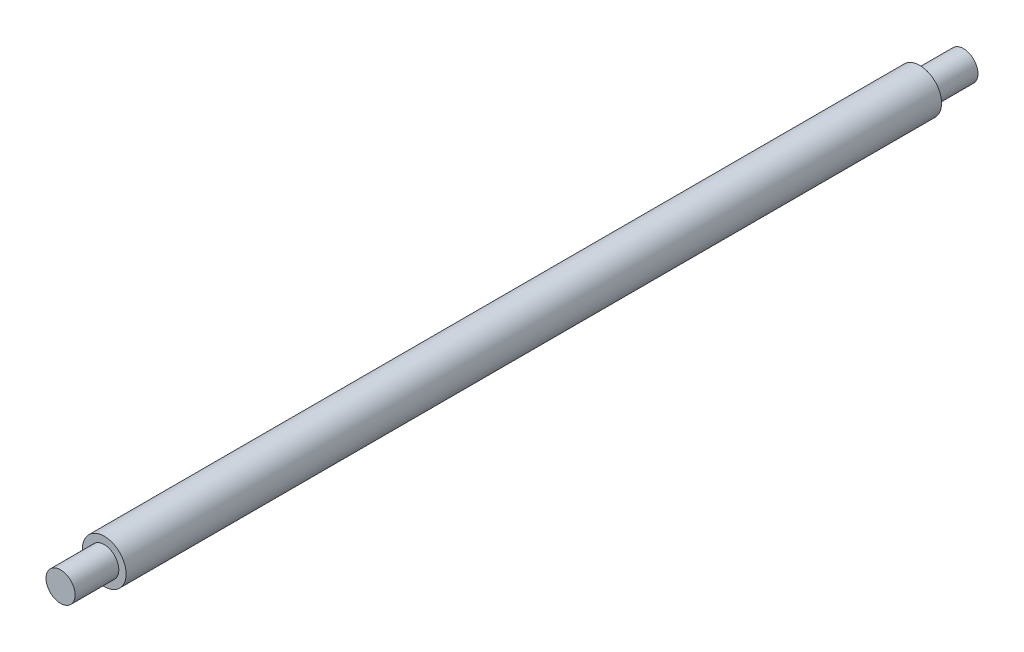
ISO-10303-21;
HEADER;
FILE_DESCRIPTION(('STEP AP214'),'2;1');
FILE_NAME('part.step','',(''),(''),'','','');
FILE_SCHEMA(('AUTOMOTIVE_DESIGN { 1 0 10303 214 1 1 1 1 }'));
ENDSEC;
DATA;
#1=APPLICATION_CONTEXT('core data for automotive mechanical design processes');
#2=APPLICATION_PROTOCOL_DEFINITION('international standard','automotive_design',2000,#1);
#3=PRODUCT_CONTEXT('',#1,'mechanical');
#4=PRODUCT('Part','Part','',(#3));
#5=PRODUCT_RELATED_PRODUCT_CATEGORY('part','',(#4));
#6=PRODUCT_DEFINITION_FORMATION('','',#4);
#7=PRODUCT_DEFINITION_CONTEXT('part definition',#1,'design');
#8=PRODUCT_DEFINITION('design','',#6,#7);
#9=PRODUCT_DEFINITION_SHAPE('','',#8);
#10=(LENGTH_UNIT() NAMED_UNIT(*) SI_UNIT(.MILLI.,.METRE.));
#11=(NAMED_UNIT(*) PLANE_ANGLE_UNIT() SI_UNIT($,.RADIAN.));
#12=(NAMED_UNIT(*) SI_UNIT($,.STERADIAN.) SOLID_ANGLE_UNIT());
#13=UNCERTAINTY_MEASURE_WITH_UNIT(LENGTH_MEASURE(1.E-05),#10,'distance_accuracy_value','');
#14=(GEOMETRIC_REPRESENTATION_CONTEXT(3) GLOBAL_UNCERTAINTY_ASSIGNED_CONTEXT((#13)) GLOBAL_UNIT_ASSIGNED_CONTEXT((#10,
#11,#12)) REPRESENTATION_CONTEXT('',''));
#15=CARTESIAN_POINT('',(0.,0.,0.));
#16=DIRECTION('',(0.,0.,1.));
#17=DIRECTION('',(1.,0.,0.));
#18=AXIS2_PLACEMENT_3D('',#15,#16,#17);
#19=CARTESIAN_POINT('',(0.,0.,355.6));
#20=DIRECTION('',(0.,0.,-1.));
#21=DIRECTION('',(-1.,0.,0.));
#22=AXIS2_PLACEMENT_3D('',#19,#20,#21);
#23=CYLINDRICAL_SURFACE('',#22,9.525);
#24=CARTESIAN_POINT('',(0.,0.,355.6));
#25=DIRECTION('',(0.,0.,1.));
#26=DIRECTION('',(1.,0.,0.));
#27=AXIS2_PLACEMENT_3D('',#24,#25,#26);
#28=CIRCLE('',#27,9.525);
#29=CARTESIAN_POINT('',(9.525,0.,355.6));
#30=VERTEX_POINT('',#29);
#31=EDGE_CURVE('E43',#30,#30,#28,.T.);
#32=ORIENTED_EDGE('',*,*,#31,.F.);
#33=EDGE_LOOP('',(#32));
#34=FACE_BOUND('',#33,.T.);
#35=CARTESIAN_POINT('',(0.,0.,0.));
#36=DIRECTION('',(0.,0.,1.));
#37=DIRECTION('',(1.,0.,0.));
#38=AXIS2_PLACEMENT_3D('',#35,#36,#37);
#39=CIRCLE('',#38,9.525);
#40=CARTESIAN_POINT('',(9.525,0.,0.));
#41=VERTEX_POINT('',#40);
#42=EDGE_CURVE('E34',#41,#41,#39,.T.);
#43=ORIENTED_EDGE('',*,*,#42,.T.);
#44=EDGE_LOOP('',(#43));
#45=FACE_BOUND('',#44,.T.);
#46=ADVANCED_FACE('F31',(#34,#45),#23,.T.);
#47=CARTESIAN_POINT('',(0.,0.,355.6));
#48=DIRECTION('',(0.,0.,1.));
#49=DIRECTION('',(1.,0.,0.));
#50=AXIS2_PLACEMENT_3D('',#47,#48,#49);
#51=PLANE('',#50);
#52=CARTESIAN_POINT('',(0.,0.,355.6));
#53=DIRECTION('',(0.,0.,1.));
#54=DIRECTION('',(1.,0.,0.));
#55=AXIS2_PLACEMENT_3D('',#52,#53,#54);
#56=CIRCLE('',#55,6.35);
#57=CARTESIAN_POINT('',(-6.35,0.,355.6));
#58=VERTEX_POINT('',#57);
#59=EDGE_CURVE('E38',#58,#58,#56,.T.);
#60=ORIENTED_EDGE('',*,*,#59,.F.);
#61=EDGE_LOOP('',(#60));
#62=FACE_BOUND('',#61,.T.);
#63=ORIENTED_EDGE('',*,*,#31,.T.);
#64=EDGE_LOOP('',(#63));
#65=FACE_BOUND('',#64,.T.);
#66=ADVANCED_FACE('F60',(#62,#65),#51,.T.);
#67=CARTESIAN_POINT('',(0.,0.,0.));
#68=DIRECTION('',(0.,0.,1.));
#69=DIRECTION('',(1.,0.,0.));
#70=AXIS2_PLACEMENT_3D('',#67,#68,#69);
#71=PLANE('',#70);
#72=CARTESIAN_POINT('',(0.,0.,0.));
#73=DIRECTION('',(0.,0.,-1.));
#74=DIRECTION('',(-1.,0.,0.));
#75=AXIS2_PLACEMENT_3D('',#72,#73,#74);
#76=CIRCLE('',#75,6.35);
#77=CARTESIAN_POINT('',(6.35,0.,0.));
#78=VERTEX_POINT('',#77);
#79=EDGE_CURVE('E10',#78,#78,#76,.T.);
#80=ORIENTED_EDGE('',*,*,#79,.F.);
#81=EDGE_LOOP('',(#80));
#82=FACE_BOUND('',#81,.T.);
#83=ORIENTED_EDGE('',*,*,#42,.F.);
#84=EDGE_LOOP('',(#83));
#85=FACE_BOUND('',#84,.T.);
#86=ADVANCED_FACE('F57',(#82,#85),#71,.F.);
#87=CARTESIAN_POINT('',(0.,0.,374.65));
#88=DIRECTION('',(0.,0.,-1.));
#89=DIRECTION('',(-1.,0.,0.));
#90=AXIS2_PLACEMENT_3D('',#87,#88,#89);
#91=CYLINDRICAL_SURFACE('',#90,6.35);
#92=CARTESIAN_POINT('',(0.,0.,374.65));
#93=DIRECTION('',(0.,0.,1.));
#94=DIRECTION('',(1.,0.,0.));
#95=AXIS2_PLACEMENT_3D('',#92,#93,#94);
#96=CIRCLE('',#95,6.35);
#97=CARTESIAN_POINT('',(-6.35,0.,374.65));
#98=VERTEX_POINT('',#97);
#99=EDGE_CURVE('E48',#98,#98,#96,.T.);
#100=CARTESIAN_POINT('',(-6.35,0.,374.65));
#101=CARTESIAN_POINT('',(-6.35,0.,374.4515625));
#102=CARTESIAN_POINT('',(-6.35,0.,374.253125));
#103=CARTESIAN_POINT('',(-6.35,0.,373.85625));
#104=CARTESIAN_POINT('',(-6.35,0.,373.6578125));
#105=CARTESIAN_POINT('',(-6.35,0.,373.2609375));
#106=CARTESIAN_POINT('',(-6.35,0.,373.0625));
#107=CARTESIAN_POINT('',(-6.35,0.,372.665625));
#108=CARTESIAN_POINT('',(-6.35,0.,372.4671875));
#109=CARTESIAN_POINT('',(-6.35,0.,372.0703125));
#110=CARTESIAN_POINT('',(-6.35,0.,371.871875));
#111=CARTESIAN_POINT('',(-6.35,0.,371.475));
#112=CARTESIAN_POINT('',(-6.35,0.,371.2765625));
#113=CARTESIAN_POINT('',(-6.35,0.,370.8796875));
#114=CARTESIAN_POINT('',(-6.35,0.,370.68125));
#115=CARTESIAN_POINT('',(-6.35,0.,370.284375));
#116=CARTESIAN_POINT('',(-6.35,0.,370.0859375));
#117=CARTESIAN_POINT('',(-6.35,0.,369.6890625));
#118=CARTESIAN_POINT('',(-6.35,0.,369.490625));
#119=CARTESIAN_POINT('',(-6.35,0.,369.09375));
#120=CARTESIAN_POINT('',(-6.35,0.,368.8953125));
#121=CARTESIAN_POINT('',(-6.35,0.,368.4984375));
#122=CARTESIAN_POINT('',(-6.35,0.,368.3));
#123=CARTESIAN_POINT('',(-6.35,0.,367.903125));
#124=CARTESIAN_POINT('',(-6.35,0.,367.7046875));
#125=CARTESIAN_POINT('',(-6.35,0.,367.3078125));
#126=CARTESIAN_POINT('',(-6.35,0.,367.109375));
#127=CARTESIAN_POINT('',(-6.35,0.,366.7125));
#128=CARTESIAN_POINT('',(-6.35,0.,366.5140625));
#129=CARTESIAN_POINT('',(-6.35,0.,366.1171875));
#130=CARTESIAN_POINT('',(-6.35,0.,365.91875));
#131=CARTESIAN_POINT('',(-6.35,0.,365.521875));
#132=CARTESIAN_POINT('',(-6.35,0.,365.3234375));
#133=CARTESIAN_POINT('',(-6.35,0.,364.9265625));
#134=CARTESIAN_POINT('',(-6.35,0.,364.728125));
#135=CARTESIAN_POINT('',(-6.35,0.,364.33125));
#136=CARTESIAN_POINT('',(-6.35,0.,364.1328125));
#137=CARTESIAN_POINT('',(-6.35,0.,363.7359375));
#138=CARTESIAN_POINT('',(-6.35,0.,363.5375));
#139=CARTESIAN_POINT('',(-6.35,0.,363.140625));
#140=CARTESIAN_POINT('',(-6.35,0.,362.9421875));
#141=CARTESIAN_POINT('',(-6.35,0.,362.5453125));
#142=CARTESIAN_POINT('',(-6.35,0.,362.346875));
#143=CARTESIAN_POINT('',(-6.35,0.,361.95));
#144=CARTESIAN_POINT('',(-6.35,0.,361.7515625));
#145=CARTESIAN_POINT('',(-6.35,0.,361.3546875));
#146=CARTESIAN_POINT('',(-6.35,0.,361.15625));
#147=CARTESIAN_POINT('',(-6.35,0.,360.759375));
#148=CARTESIAN_POINT('',(-6.35,0.,360.5609375));
#149=CARTESIAN_POINT('',(-6.35,0.,360.1640625));
#150=CARTESIAN_POINT('',(-6.35,0.,359.965625));
#151=CARTESIAN_POINT('',(-6.35,0.,359.56875));
#152=CARTESIAN_POINT('',(-6.35,0.,359.3703125));
#153=CARTESIAN_POINT('',(-6.35,0.,358.9734375));
#154=CARTESIAN_POINT('',(-6.35,0.,358.775));
#155=CARTESIAN_POINT('',(-6.35,0.,358.378125));
#156=CARTESIAN_POINT('',(-6.35,0.,358.1796875));
#157=CARTESIAN_POINT('',(-6.35,0.,357.7828125));
#158=CARTESIAN_POINT('',(-6.35,0.,357.584375));
#159=CARTESIAN_POINT('',(-6.35,0.,357.1875));
#160=CARTESIAN_POINT('',(-6.35,0.,356.9890625));
#161=CARTESIAN_POINT('',(-6.35,0.,356.5921875));
#162=CARTESIAN_POINT('',(-6.35,0.,356.39375));
#163=CARTESIAN_POINT('',(-6.35,0.,355.996875));
#164=CARTESIAN_POINT('',(-6.35,0.,355.7984375));
#165=CARTESIAN_POINT('',(-6.35,0.,355.6));
#166=B_SPLINE_CURVE_WITH_KNOTS('',3,(#100,#101,#102,#103,#104,#105,#106,#107,#108,#109,#110,
#111,#112,#113,#114,#115,#116,#117,#118,#119,#120,#121,#122,#123,#124,#125,#126,#127,#128,#129,
#130,#131,#132,#133,#134,#135,#136,#137,#138,#139,#140,#141,#142,#143,#144,#145,#146,#147,#148,
#149,#150,#151,#152,#153,#154,#155,#156,#157,#158,#159,#160,#161,#162,#163,#164,#165),
.UNSPECIFIED.,.F.,.F.,(4,2,2,2,2,2,2,2,2,2,2,2,2,2,2,2,2,2,2,2,2,2,2,2,2,2,2,2,2,2,2,2,4),(0.,
0.595312499999945,1.19062499999995,1.78593749999995,2.38124999999995,2.97656249999995,
3.57187499999995,4.16718749999995,4.76249999999995,5.35781249999995,5.95312499999995,
6.54843749999995,7.14374999999995,7.73906249999995,8.33437499999995,8.92968749999995,
9.52499999999995,10.1203125,10.715625,11.3109375,11.90625,12.5015625,13.096875,13.6921875,
14.2875,14.8828125,15.478125,16.0734375,16.66875,17.2640625,17.859375,18.4546875,19.05),.UNSPECIFIED.);
#167=EDGE_CURVE('BSEAM59',#98,#58,#166,.T.);
#168=ORIENTED_EDGE('',*,*,#99,.F.);
#169=ORIENTED_EDGE('',*,*,#59,.T.);
#170=ORIENTED_EDGE('',*,*,#167,.T.);
#171=ORIENTED_EDGE('',*,*,#167,.F.);
#172=EDGE_LOOP('',(#168,#170,#169,#171));
#173=FACE_BOUND('',#172,.T.);
#174=ADVANCED_FACE('F59',(#173),#91,.T.);
#175=CARTESIAN_POINT('',(0.,0.,374.65));
#176=DIRECTION('',(0.,0.,1.));
#177=DIRECTION('',(1.,0.,0.));
#178=AXIS2_PLACEMENT_3D('',#175,#176,#177);
#179=PLANE('',#178);
#180=ORIENTED_EDGE('',*,*,#99,.T.);
#181=EDGE_LOOP('',(#180));
#182=FACE_BOUND('',#181,.T.);
#183=ADVANCED_FACE('F66',(#182),#179,.T.);
#184=CARTESIAN_POINT('',(0.,0.,-19.05));
#185=DIRECTION('',(0.,0.,1.));
#186=DIRECTION('',(1.,0.,0.));
#187=AXIS2_PLACEMENT_3D('',#184,#185,#186);
#188=CYLINDRICAL_SURFACE('',#187,6.35);
#189=CARTESIAN_POINT('',(0.,0.,-19.05));
#190=DIRECTION('',(0.,0.,-1.));
#191=DIRECTION('',(-1.,0.,0.));
#192=AXIS2_PLACEMENT_3D('',#189,#190,#191);
#193=CIRCLE('',#192,6.35);
#194=CARTESIAN_POINT('',(6.35,0.,-19.05));
#195=VERTEX_POINT('',#194);
#196=EDGE_CURVE('E47',#195,#195,#193,.T.);
#197=CARTESIAN_POINT('',(6.35,0.,-19.05));
#198=CARTESIAN_POINT('',(6.35,0.,-18.8515625));
#199=CARTESIAN_POINT('',(6.35,0.,-18.653125));
#200=CARTESIAN_POINT('',(6.35,0.,-18.25625));
#201=CARTESIAN_POINT('',(6.35,0.,-18.0578125));
#202=CARTESIAN_POINT('',(6.35,0.,-17.6609375));
#203=CARTESIAN_POINT('',(6.35,0.,-17.4625));
#204=CARTESIAN_POINT('',(6.35,0.,-17.065625));
#205=CARTESIAN_POINT('',(6.35,0.,-16.8671875));
#206=CARTESIAN_POINT('',(6.35,0.,-16.4703125));
#207=CARTESIAN_POINT('',(6.35,0.,-16.271875));
#208=CARTESIAN_POINT('',(6.35,0.,-15.875));
#209=CARTESIAN_POINT('',(6.35,0.,-15.6765625));
#210=CARTESIAN_POINT('',(6.35,0.,-15.2796875));
#211=CARTESIAN_POINT('',(6.35,0.,-15.08125));
#212=CARTESIAN_POINT('',(6.35,0.,-14.684375));
#213=CARTESIAN_POINT('',(6.35,0.,-14.4859375));
#214=CARTESIAN_POINT('',(6.35,0.,-14.0890625));
#215=CARTESIAN_POINT('',(6.35,0.,-13.890625));
#216=CARTESIAN_POINT('',(6.35,0.,-13.49375));
#217=CARTESIAN_POINT('',(6.35,0.,-13.2953125));
#218=CARTESIAN_POINT('',(6.35,0.,-12.8984375));
#219=CARTESIAN_POINT('',(6.35,0.,-12.7));
#220=CARTESIAN_POINT('',(6.35,0.,-12.303125));
#221=CARTESIAN_POINT('',(6.35,0.,-12.1046875));
#222=CARTESIAN_POINT('',(6.35,0.,-11.7078125));
#223=CARTESIAN_POINT('',(6.35,0.,-11.509375));
#224=CARTESIAN_POINT('',(6.35,0.,-11.1125));
#225=CARTESIAN_POINT('',(6.35,0.,-10.9140625));
#226=CARTESIAN_POINT('',(6.35,0.,-10.5171875));
#227=CARTESIAN_POINT('',(6.35,0.,-10.31875));
#228=CARTESIAN_POINT('',(6.35,0.,-9.921875));
#229=CARTESIAN_POINT('',(6.35,0.,-9.7234375));
#230=CARTESIAN_POINT('',(6.35,0.,-9.3265625));
#231=CARTESIAN_POINT('',(6.35,0.,-9.128125));
#232=CARTESIAN_POINT('',(6.35,0.,-8.73125));
#233=CARTESIAN_POINT('',(6.35,0.,-8.5328125));
#234=CARTESIAN_POINT('',(6.35,0.,-8.1359375));
#235=CARTESIAN_POINT('',(6.35,0.,-7.9375));
#236=CARTESIAN_POINT('',(6.35,0.,-7.540625));
#237=CARTESIAN_POINT('',(6.35,0.,-7.3421875));
#238=CARTESIAN_POINT('',(6.35,0.,-6.9453125));
#239=CARTESIAN_POINT('',(6.35,0.,-6.746875));
#240=CARTESIAN_POINT('',(6.35,0.,-6.35));
#241=CARTESIAN_POINT('',(6.35,0.,-6.1515625));
#242=CARTESIAN_POINT('',(6.35,0.,-5.7546875));
#243=CARTESIAN_POINT('',(6.35,0.,-5.55625));
#244=CARTESIAN_POINT('',(6.35,0.,-5.159375));
#245=CARTESIAN_POINT('',(6.35,0.,-4.9609375));
#246=CARTESIAN_POINT('',(6.35,0.,-4.5640625));
#247=CARTESIAN_POINT('',(6.35,0.,-4.365625));
#248=CARTESIAN_POINT('',(6.35,0.,-3.96875));
#249=CARTESIAN_POINT('',(6.35,0.,-3.7703125));
#250=CARTESIAN_POINT('',(6.35,0.,-3.3734375));
#251=CARTESIAN_POINT('',(6.35,0.,-3.175));
#252=CARTESIAN_POINT('',(6.35,0.,-2.778125));
#253=CARTESIAN_POINT('',(6.35,0.,-2.5796875));
#254=CARTESIAN_POINT('',(6.35,0.,-2.1828125));
#255=CARTESIAN_POINT('',(6.35,0.,-1.984375));
#256=CARTESIAN_POINT('',(6.35,0.,-1.5875));
#257=CARTESIAN_POINT('',(6.35,0.,-1.3890625));
#258=CARTESIAN_POINT('',(6.35,0.,-0.992187500000001));
#259=CARTESIAN_POINT('',(6.35,0.,-0.793750000000001));
#260=CARTESIAN_POINT('',(6.35,0.,-0.396875));
#261=CARTESIAN_POINT('',(6.35,0.,-0.1984375));
#262=CARTESIAN_POINT('',(6.35,0.,0.));
#263=B_SPLINE_CURVE_WITH_KNOTS('',3,(#197,#198,#199,#200,#201,#202,#203,#204,#205,#206,#207,
#208,#209,#210,#211,#212,#213,#214,#215,#216,#217,#218,#219,#220,#221,#222,#223,#224,#225,#226,
#227,#228,#229,#230,#231,#232,#233,#234,#235,#236,#237,#238,#239,#240,#241,#242,#243,#244,#245,
#246,#247,#248,#249,#250,#251,#252,#253,#254,#255,#256,#257,#258,#259,#260,#261,#262),
.UNSPECIFIED.,.F.,.F.,(4,2,2,2,2,2,2,2,2,2,2,2,2,2,2,2,2,2,2,2,2,2,2,2,2,2,2,2,2,2,2,2,4),(0.,
0.5953125,1.190625,1.7859375,2.38125,2.9765625,3.571875,4.1671875,4.7625,5.3578125,5.953125,
6.5484375,7.14375,7.7390625,8.334375,8.9296875,9.525,10.1203125,10.715625,11.3109375,11.90625,
12.5015625,13.096875,13.6921875,14.2875,14.8828125,15.478125,16.0734375,16.66875,17.2640625,
17.859375,18.4546875,19.05),.UNSPECIFIED.);
#264=EDGE_CURVE('BSEAM94',#195,#78,#263,.T.);
#265=ORIENTED_EDGE('',*,*,#196,.F.);
#266=ORIENTED_EDGE('',*,*,#79,.T.);
#267=ORIENTED_EDGE('',*,*,#264,.T.);
#268=ORIENTED_EDGE('',*,*,#264,.F.);
#269=EDGE_LOOP('',(#265,#267,#266,#268));
#270=FACE_BOUND('',#269,.T.);
#271=ADVANCED_FACE('F94',(#270),#188,.T.);
#272=CARTESIAN_POINT('',(0.,0.,-19.05));
#273=DIRECTION('',(0.,0.,-1.));
#274=DIRECTION('',(-1.,0.,0.));
#275=AXIS2_PLACEMENT_3D('',#272,#273,#274);
#276=PLANE('',#275);
#277=ORIENTED_EDGE('',*,*,#196,.T.);
#278=EDGE_LOOP('',(#277));
#279=FACE_BOUND('',#278,.T.);
#280=ADVANCED_FACE('F108',(#279),#276,.T.);
#281=CLOSED_SHELL('',(#46,#66,#86,#174,#183,#271,#280));
#282=MANIFOLD_SOLID_BREP('B2',#281);
#283=ADVANCED_BREP_SHAPE_REPRESENTATION('',(#18,#282),#14);
#284=SHAPE_DEFINITION_REPRESENTATION(#9,#283);
ENDSEC;
END-ISO-10303-21;
